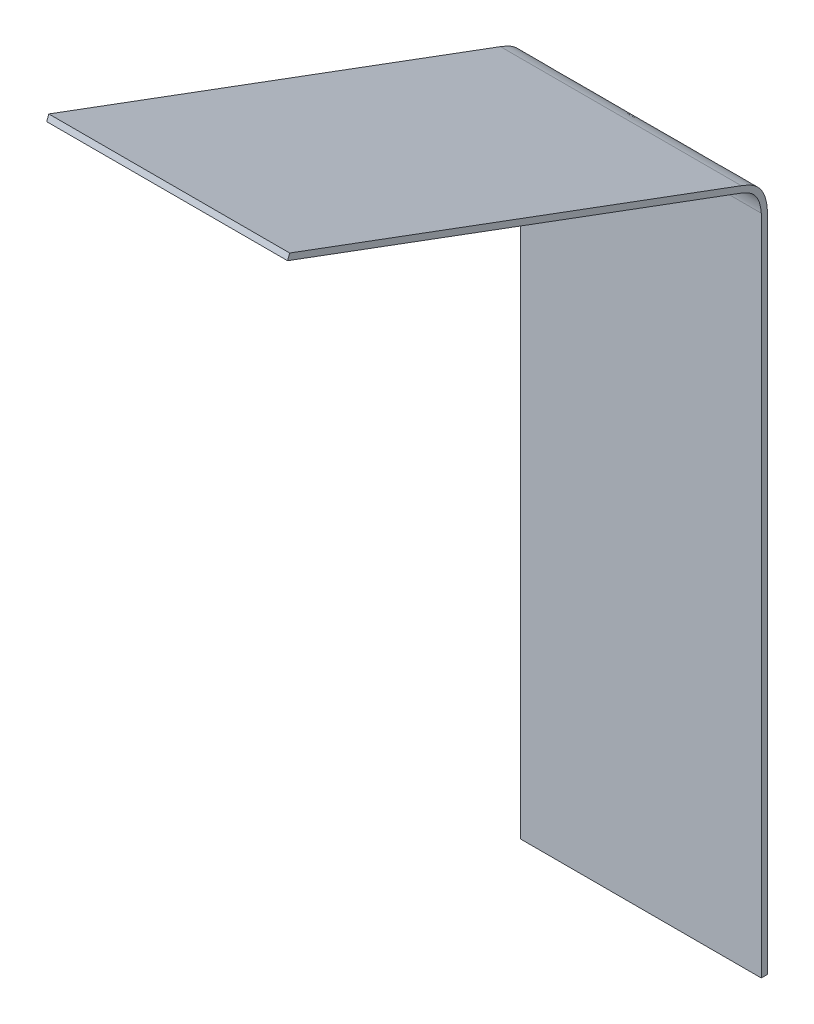
ISO-10303-21;
HEADER;
FILE_DESCRIPTION(('STEP AP214'),'2;1');
FILE_NAME('part.step','',(''),(''),'','','');
FILE_SCHEMA(('AUTOMOTIVE_DESIGN { 1 0 10303 214 1 1 1 1 }'));
ENDSEC;
DATA;
#1=APPLICATION_CONTEXT('core data for automotive mechanical design processes');
#2=APPLICATION_PROTOCOL_DEFINITION('international standard','automotive_design',2000,#1);
#3=PRODUCT_CONTEXT('',#1,'mechanical');
#4=PRODUCT('Part','Part','',(#3));
#5=PRODUCT_RELATED_PRODUCT_CATEGORY('part','',(#4));
#6=PRODUCT_DEFINITION_FORMATION('','',#4);
#7=PRODUCT_DEFINITION_CONTEXT('part definition',#1,'design');
#8=PRODUCT_DEFINITION('design','',#6,#7);
#9=PRODUCT_DEFINITION_SHAPE('','',#8);
#10=(LENGTH_UNIT() NAMED_UNIT(*) SI_UNIT(.MILLI.,.METRE.));
#11=(NAMED_UNIT(*) PLANE_ANGLE_UNIT() SI_UNIT($,.RADIAN.));
#12=(NAMED_UNIT(*) SI_UNIT($,.STERADIAN.) SOLID_ANGLE_UNIT());
#13=UNCERTAINTY_MEASURE_WITH_UNIT(LENGTH_MEASURE(1.E-05),#10,'distance_accuracy_value','');
#14=(GEOMETRIC_REPRESENTATION_CONTEXT(3) GLOBAL_UNCERTAINTY_ASSIGNED_CONTEXT((#13)) GLOBAL_UNIT_ASSIGNED_CONTEXT((#10,
#11,#12)) REPRESENTATION_CONTEXT('',''));
#15=CARTESIAN_POINT('',(0.,0.,0.));
#16=DIRECTION('',(0.,0.,1.));
#17=DIRECTION('',(1.,0.,0.));
#18=AXIS2_PLACEMENT_3D('',#15,#16,#17);
#19=CARTESIAN_POINT('',(10.,-27.5,0.5));
#20=DIRECTION('',(-1.,0.,0.));
#21=DIRECTION('',(0.,0.,1.));
#22=AXIS2_PLACEMENT_3D('',#19,#20,#21);
#23=PLANE('',#22);
#24=DIRECTION('',(0.,1.,0.));
#25=VECTOR('',#24,1.);
#26=CARTESIAN_POINT('',(10.,-27.5,0.));
#27=LINE('',#26,#25);
#28=CARTESIAN_POINT('',(10.,-27.5,0.));
#29=VERTEX_POINT('',#28);
#30=CARTESIAN_POINT('',(10.,27.5,0.));
#31=VERTEX_POINT('',#30);
#32=EDGE_CURVE('E158',#29,#31,#27,.T.);
#33=ORIENTED_EDGE('',*,*,#32,.T.);
#34=CARTESIAN_POINT('',(10.,30.3053928313691,2.15626773205285));
#35=CARTESIAN_POINT('',(10.,30.1974864128318,1.86533608881739));
#36=CARTESIAN_POINT('',(10.,29.952226684656,1.28591543933792));
#37=CARTESIAN_POINT('',(10.,29.4643885200826,0.685759588637019));
#38=CARTESIAN_POINT('',(10.,28.9128358146793,0.33183102841355));
#39=CARTESIAN_POINT('',(10.,28.4224602528136,0.142334357290641));
#40=CARTESIAN_POINT('',(10.,27.8864907898108,0.0317166884469971));
#41=CARTESIAN_POINT('',(10.,27.6386707879078,0.));
#42=CARTESIAN_POINT('',(10.,27.5,0.));
#43=B_SPLINE_CURVE_WITH_KNOTS('',3,(#34,#35,#36,#37,#38,#39,#40,#41,#42),.UNSPECIFIED.,.F.,.F.,
(4,1,1,1,1,1,4),(0.,0.25,0.5,0.625,0.75,0.875,1.),.UNSPECIFIED.);
#44=CARTESIAN_POINT('',(10.,30.3053928313691,2.15626773205285));
#45=VERTEX_POINT('',#44);
#46=EDGE_CURVE('E178',#31,#45,#43,.F.);
#47=ORIENTED_EDGE('',*,*,#46,.T.);
#48=DIRECTION('',(0.,0.347750629196975,0.937587062567049));
#49=VECTOR('',#48,1.);
#50=CARTESIAN_POINT('',(10.,30.3053928313691,2.15626773205285));
#51=LINE('',#50,#49);
#52=CARTESIAN_POINT('',(10.,44.2154179992481,39.6597502347348));
#53=VERTEX_POINT('',#52);
#54=EDGE_CURVE('E181',#45,#53,#51,.T.);
#55=ORIENTED_EDGE('',*,*,#54,.T.);
#56=DIRECTION('',(0.,-0.937587062567048,0.347750629196978));
#57=VECTOR('',#56,1.);
#58=CARTESIAN_POINT('',(10.,44.2154179992481,39.6597502347348));
#59=LINE('',#58,#57);
#60=CARTESIAN_POINT('',(10.,43.7466244679646,39.8336255493333));
#61=VERTEX_POINT('',#60);
#62=EDGE_CURVE('E152',#53,#61,#59,.T.);
#63=ORIENTED_EDGE('',*,*,#62,.T.);
#64=DIRECTION('',(0.,-0.347750629196975,-0.937587062567049));
#65=VECTOR('',#64,1.);
#66=CARTESIAN_POINT('',(10.,29.8365993000855,2.33014304665134));
#67=LINE('',#66,#65);
#68=CARTESIAN_POINT('',(10.,29.8365993000855,2.33014304665134));
#69=VERTEX_POINT('',#68);
#70=EDGE_CURVE('E156',#61,#69,#67,.T.);
#71=ORIENTED_EDGE('',*,*,#70,.T.);
#72=CARTESIAN_POINT('',(10.,27.5,0.5));
#73=CARTESIAN_POINT('',(10.,27.6557787283989,0.5));
#74=CARTESIAN_POINT('',(10.,29.0473017400975,0.711024800769217));
#75=CARTESIAN_POINT('',(10.,29.5263153299715,1.49357163117268));
#76=CARTESIAN_POINT('',(10.,29.8365993000855,2.33014304665134));
#77=B_SPLINE_CURVE_WITH_KNOTS('',3,(#72,#73,#74,#75,#76),.UNSPECIFIED.,.F.,.F.,(4,1,4),(0.,
0.267127670035475,1.),.UNSPECIFIED.);
#78=CARTESIAN_POINT('',(10.,27.5,0.5));
#79=VERTEX_POINT('',#78);
#80=EDGE_CURVE('E111',#69,#79,#77,.F.);
#81=ORIENTED_EDGE('',*,*,#80,.T.);
#82=DIRECTION('',(0.,1.,0.));
#83=VECTOR('',#82,1.);
#84=CARTESIAN_POINT('',(10.,-27.5,0.5));
#85=LINE('',#84,#83);
#86=CARTESIAN_POINT('',(10.,-27.5,0.5));
#87=VERTEX_POINT('',#86);
#88=EDGE_CURVE('E73',#87,#79,#85,.T.);
#89=ORIENTED_EDGE('',*,*,#88,.F.);
#90=DIRECTION('',(0.,0.,-1.));
#91=VECTOR('',#90,1.);
#92=CARTESIAN_POINT('',(10.,-27.5,0.5));
#93=LINE('',#92,#91);
#94=EDGE_CURVE('E41',#87,#29,#93,.T.);
#95=ORIENTED_EDGE('',*,*,#94,.T.);
#96=EDGE_LOOP('',(#33,#47,#55,#63,#71,#81,#89,#95));
#97=FACE_BOUND('',#96,.T.);
#98=ADVANCED_FACE('F33',(#97),#23,.F.);
#99=CARTESIAN_POINT('',(-10.,-27.5,0.5));
#100=DIRECTION('',(1.,0.,0.));
#101=DIRECTION('',(0.,0.,-1.));
#102=AXIS2_PLACEMENT_3D('',#99,#100,#101);
#103=PLANE('',#102);
#104=DIRECTION('',(0.,-1.,0.));
#105=VECTOR('',#104,1.);
#106=CARTESIAN_POINT('',(-10.,-27.5,0.));
#107=LINE('',#106,#105);
#108=CARTESIAN_POINT('',(-10.,27.5,0.));
#109=VERTEX_POINT('',#108);
#110=CARTESIAN_POINT('',(-10.,-27.5,0.));
#111=VERTEX_POINT('',#110);
#112=EDGE_CURVE('E63',#109,#111,#107,.T.);
#113=ORIENTED_EDGE('',*,*,#112,.T.);
#114=DIRECTION('',(0.,0.,-1.));
#115=VECTOR('',#114,1.);
#116=CARTESIAN_POINT('',(-10.,-27.5,0.5));
#117=LINE('',#116,#115);
#118=CARTESIAN_POINT('',(-10.,-27.5,0.5));
#119=VERTEX_POINT('',#118);
#120=EDGE_CURVE('E11',#119,#111,#117,.T.);
#121=ORIENTED_EDGE('',*,*,#120,.F.);
#122=DIRECTION('',(0.,-1.,0.));
#123=VECTOR('',#122,1.);
#124=CARTESIAN_POINT('',(-10.,-27.5,0.5));
#125=LINE('',#124,#123);
#126=CARTESIAN_POINT('',(-10.,27.5,0.5));
#127=VERTEX_POINT('',#126);
#128=EDGE_CURVE('E127',#127,#119,#125,.T.);
#129=ORIENTED_EDGE('',*,*,#128,.F.);
#130=CARTESIAN_POINT('',(-10.,27.5,0.5));
#131=CARTESIAN_POINT('',(-10.,27.6557787283989,0.5));
#132=CARTESIAN_POINT('',(-10.,29.0473017400975,0.711024800769217));
#133=CARTESIAN_POINT('',(-10.,29.5263153299715,1.49357163117268));
#134=CARTESIAN_POINT('',(-10.,29.8365993000855,2.33014304665134));
#135=B_SPLINE_CURVE_WITH_KNOTS('',3,(#130,#131,#132,#133,#134),.UNSPECIFIED.,.F.,.F.,(4,1,4),
(0.,0.267127670035475,1.),.UNSPECIFIED.);
#136=CARTESIAN_POINT('',(-10.,29.8365993000855,2.33014304665134));
#137=VERTEX_POINT('',#136);
#138=EDGE_CURVE('E110',#127,#137,#135,.T.);
#139=ORIENTED_EDGE('',*,*,#138,.T.);
#140=DIRECTION('',(0.,0.347750629196975,0.937587062567049));
#141=VECTOR('',#140,1.);
#142=CARTESIAN_POINT('',(-10.,29.8365993000855,2.33014304665134));
#143=LINE('',#142,#141);
#144=CARTESIAN_POINT('',(-10.,43.7466244679646,39.8336255493333));
#145=VERTEX_POINT('',#144);
#146=EDGE_CURVE('E118',#137,#145,#143,.T.);
#147=ORIENTED_EDGE('',*,*,#146,.T.);
#148=DIRECTION('',(0.,0.937587062567048,-0.347750629196979));
#149=VECTOR('',#148,1.);
#150=CARTESIAN_POINT('',(-10.,44.2154179992481,39.6597502347348));
#151=LINE('',#150,#149);
#152=CARTESIAN_POINT('',(-10.,44.2154179992481,39.6597502347348));
#153=VERTEX_POINT('',#152);
#154=EDGE_CURVE('E123',#145,#153,#151,.T.);
#155=ORIENTED_EDGE('',*,*,#154,.T.);
#156=DIRECTION('',(0.,-0.347750629196975,-0.937587062567049));
#157=VECTOR('',#156,1.);
#158=CARTESIAN_POINT('',(-10.,30.3053928313691,2.15626773205285));
#159=LINE('',#158,#157);
#160=CARTESIAN_POINT('',(-10.,30.3053928313691,2.15626773205285));
#161=VERTEX_POINT('',#160);
#162=EDGE_CURVE('E141',#153,#161,#159,.T.);
#163=ORIENTED_EDGE('',*,*,#162,.T.);
#164=CARTESIAN_POINT('',(-10.,30.3053928313691,2.15626773205285));
#165=CARTESIAN_POINT('',(-10.,30.1974864128318,1.86533608881739));
#166=CARTESIAN_POINT('',(-10.,29.952226684656,1.28591543933792));
#167=CARTESIAN_POINT('',(-10.,29.4643885200826,0.685759588637019));
#168=CARTESIAN_POINT('',(-10.,28.9128358146793,0.33183102841355));
#169=CARTESIAN_POINT('',(-10.,28.4224602528136,0.142334357290641));
#170=CARTESIAN_POINT('',(-10.,27.8864907898108,0.0317166884469971));
#171=CARTESIAN_POINT('',(-10.,27.6386707879078,0.));
#172=CARTESIAN_POINT('',(-10.,27.5,0.));
#173=B_SPLINE_CURVE_WITH_KNOTS('',3,(#164,#165,#166,#167,#168,#169,#170,#171,#172),
.UNSPECIFIED.,.F.,.F.,(4,1,1,1,1,1,4),(0.,0.25,0.5,0.625,0.75,0.875,1.),.UNSPECIFIED.);
#174=EDGE_CURVE('E115',#161,#109,#173,.T.);
#175=ORIENTED_EDGE('',*,*,#174,.T.);
#176=EDGE_LOOP('',(#113,#121,#129,#139,#147,#155,#163,#175));
#177=FACE_BOUND('',#176,.T.);
#178=ADVANCED_FACE('F126',(#177),#103,.F.);
#179=CARTESIAN_POINT('',(-10.,-27.5,0.5));
#180=DIRECTION('',(0.,1.,0.));
#181=DIRECTION('',(0.,0.,1.));
#182=AXIS2_PLACEMENT_3D('',#179,#180,#181);
#183=PLANE('',#182);
#184=DIRECTION('',(1.,0.,0.));
#185=VECTOR('',#184,1.);
#186=CARTESIAN_POINT('',(-10.,-27.5,0.));
#187=LINE('',#186,#185);
#188=EDGE_CURVE('E68',#111,#29,#187,.T.);
#189=ORIENTED_EDGE('',*,*,#188,.T.);
#190=ORIENTED_EDGE('',*,*,#94,.F.);
#191=DIRECTION('',(1.,0.,0.));
#192=VECTOR('',#191,1.);
#193=CARTESIAN_POINT('',(-10.,-27.5,0.5));
#194=LINE('',#193,#192);
#195=EDGE_CURVE('E49',#119,#87,#194,.T.);
#196=ORIENTED_EDGE('',*,*,#195,.F.);
#197=ORIENTED_EDGE('',*,*,#120,.T.);
#198=EDGE_LOOP('',(#189,#190,#196,#197));
#199=FACE_BOUND('',#198,.T.);
#200=ADVANCED_FACE('F210',(#199),#183,.F.);
#201=CARTESIAN_POINT('',(0.,0.,0.5));
#202=DIRECTION('',(0.,0.,-1.));
#203=DIRECTION('',(-1.,0.,0.));
#204=AXIS2_PLACEMENT_3D('',#201,#202,#203);
#205=PLANE('',#204);
#206=ORIENTED_EDGE('',*,*,#88,.T.);
#207=DIRECTION('',(-1.,0.,0.));
#208=VECTOR('',#207,1.);
#209=CARTESIAN_POINT('',(-10.,27.5,0.5));
#210=LINE('',#209,#208);
#211=EDGE_CURVE('E160',#79,#127,#210,.T.);
#212=ORIENTED_EDGE('',*,*,#211,.T.);
#213=ORIENTED_EDGE('',*,*,#128,.T.);
#214=ORIENTED_EDGE('',*,*,#195,.T.);
#215=EDGE_LOOP('',(#206,#212,#213,#214));
#216=FACE_BOUND('',#215,.T.);
#217=ADVANCED_FACE('F207',(#216),#205,.F.);
#218=CARTESIAN_POINT('',(0.,0.,0.));
#219=DIRECTION('',(0.,0.,-1.));
#220=DIRECTION('',(-1.,0.,0.));
#221=AXIS2_PLACEMENT_3D('',#218,#219,#220);
#222=PLANE('',#221);
#223=ORIENTED_EDGE('',*,*,#32,.F.);
#224=ORIENTED_EDGE('',*,*,#188,.F.);
#225=ORIENTED_EDGE('',*,*,#112,.F.);
#226=DIRECTION('',(-1.,0.,0.));
#227=VECTOR('',#226,1.);
#228=CARTESIAN_POINT('',(-10.,27.5,0.));
#229=LINE('',#228,#227);
#230=EDGE_CURVE('E165',#31,#109,#229,.T.);
#231=ORIENTED_EDGE('',*,*,#230,.F.);
#232=EDGE_LOOP('',(#223,#224,#225,#231));
#233=FACE_BOUND('',#232,.T.);
#234=ADVANCED_FACE('F173',(#233),#222,.T.);
#235=CARTESIAN_POINT('',(53.1986449242807,27.5,0.5));
#236=CARTESIAN_POINT('',(53.1986449242807,27.6557787283989,0.5));
#237=CARTESIAN_POINT('',(53.1986449242807,29.0473017400975,0.711024800769217));
#238=CARTESIAN_POINT('',(53.1986449242807,29.5263153299715,1.49357163117268));
#239=CARTESIAN_POINT('',(53.1986449242807,29.8365993000855,2.33014304665134));
#240=B_SPLINE_CURVE_WITH_KNOTS('',3,(#235,#236,#237,#238,#239),.UNSPECIFIED.,.F.,.F.,(4,1,4),
(0.,0.267127670035475,1.),.UNSPECIFIED.);
#241=DIRECTION('',(-1.,0.,0.));
#242=VECTOR('',#241,1.);
#243=SURFACE_OF_LINEAR_EXTRUSION('',#240,#242);
#244=ORIENTED_EDGE('',*,*,#80,.F.);
#245=DIRECTION('',(-1.,0.,0.));
#246=VECTOR('',#245,1.);
#247=CARTESIAN_POINT('',(53.1986449242807,29.8365993000855,2.33014304665134));
#248=LINE('',#247,#246);
#249=EDGE_CURVE('E105',#69,#137,#248,.T.);
#250=ORIENTED_EDGE('',*,*,#249,.T.);
#251=ORIENTED_EDGE('',*,*,#138,.F.);
#252=ORIENTED_EDGE('',*,*,#211,.F.);
#253=EDGE_LOOP('',(#244,#250,#251,#252));
#254=FACE_BOUND('',#253,.T.);
#255=ADVANCED_FACE('F107',(#254),#243,.T.);
#256=CARTESIAN_POINT('',(53.1986449242807,30.3053928313691,2.15626773205285));
#257=CARTESIAN_POINT('',(53.1986449242807,30.1974864128318,1.86533608881739));
#258=CARTESIAN_POINT('',(53.1986449242807,29.952226684656,1.28591543933792));
#259=CARTESIAN_POINT('',(53.1986449242807,29.4643885200826,0.685759588637019));
#260=CARTESIAN_POINT('',(53.1986449242807,28.9128358146793,0.33183102841355));
#261=CARTESIAN_POINT('',(53.1986449242807,28.4224602528136,0.142334357290641));
#262=CARTESIAN_POINT('',(53.1986449242807,27.8864907898108,0.0317166884469971));
#263=CARTESIAN_POINT('',(53.1986449242807,27.6386707879078,0.));
#264=CARTESIAN_POINT('',(53.1986449242807,27.5,0.));
#265=B_SPLINE_CURVE_WITH_KNOTS('',3,(#256,#257,#258,#259,#260,#261,#262,#263,#264),
.UNSPECIFIED.,.F.,.F.,(4,1,1,1,1,1,4),(0.,0.25,0.5,0.625,0.75,0.875,1.),.UNSPECIFIED.);
#266=DIRECTION('',(-1.,0.,0.));
#267=VECTOR('',#266,1.);
#268=SURFACE_OF_LINEAR_EXTRUSION('',#265,#267);
#269=ORIENTED_EDGE('',*,*,#46,.F.);
#270=ORIENTED_EDGE('',*,*,#230,.T.);
#271=ORIENTED_EDGE('',*,*,#174,.F.);
#272=DIRECTION('',(-1.,0.,0.));
#273=VECTOR('',#272,1.);
#274=CARTESIAN_POINT('',(53.1986449242807,30.3053928313691,2.15626773205285));
#275=LINE('',#274,#273);
#276=EDGE_CURVE('E147',#45,#161,#275,.T.);
#277=ORIENTED_EDGE('',*,*,#276,.F.);
#278=EDGE_LOOP('',(#269,#270,#271,#277));
#279=FACE_BOUND('',#278,.T.);
#280=ADVANCED_FACE('F179',(#279),#268,.T.);
#281=CARTESIAN_POINT('',(53.1986449242807,30.3053928313691,2.15626773205285));
#282=DIRECTION('',(0.,0.937587062567049,-0.347750629196975));
#283=DIRECTION('',(0.,0.347750629196975,0.937587062567049));
#284=AXIS2_PLACEMENT_3D('',#281,#282,#283);
#285=PLANE('',#284);
#286=ORIENTED_EDGE('',*,*,#54,.F.);
#287=ORIENTED_EDGE('',*,*,#276,.T.);
#288=ORIENTED_EDGE('',*,*,#162,.F.);
#289=DIRECTION('',(-1.,0.,0.));
#290=VECTOR('',#289,1.);
#291=CARTESIAN_POINT('',(53.1986449242807,44.2154179992481,39.6597502347348));
#292=LINE('',#291,#290);
#293=EDGE_CURVE('E153',#53,#153,#292,.T.);
#294=ORIENTED_EDGE('',*,*,#293,.F.);
#295=EDGE_LOOP('',(#286,#287,#288,#294));
#296=FACE_BOUND('',#295,.T.);
#297=ADVANCED_FACE('F256',(#296),#285,.T.);
#298=CARTESIAN_POINT('',(53.1986449242807,44.2154179992481,39.6597502347348));
#299=DIRECTION('',(0.,0.347750629196978,0.937587062567048));
#300=DIRECTION('',(0.,-0.937587062567048,0.347750629196978));
#301=AXIS2_PLACEMENT_3D('',#298,#299,#300);
#302=PLANE('',#301);
#303=ORIENTED_EDGE('',*,*,#62,.F.);
#304=ORIENTED_EDGE('',*,*,#293,.T.);
#305=ORIENTED_EDGE('',*,*,#154,.F.);
#306=DIRECTION('',(-1.,0.,0.));
#307=VECTOR('',#306,1.);
#308=CARTESIAN_POINT('',(53.1986449242807,43.7466244679646,39.8336255493333));
#309=LINE('',#308,#307);
#310=EDGE_CURVE('E114',#61,#145,#309,.T.);
#311=ORIENTED_EDGE('',*,*,#310,.F.);
#312=EDGE_LOOP('',(#303,#304,#305,#311));
#313=FACE_BOUND('',#312,.T.);
#314=ADVANCED_FACE('F265',(#313),#302,.T.);
#315=CARTESIAN_POINT('',(53.1986449242807,29.8365993000855,2.33014304665134));
#316=DIRECTION('',(0.,-0.937587062567049,0.347750629196975));
#317=DIRECTION('',(0.,-0.347750629196975,-0.937587062567049));
#318=AXIS2_PLACEMENT_3D('',#315,#316,#317);
#319=PLANE('',#318);
#320=ORIENTED_EDGE('',*,*,#70,.F.);
#321=ORIENTED_EDGE('',*,*,#310,.T.);
#322=ORIENTED_EDGE('',*,*,#146,.F.);
#323=ORIENTED_EDGE('',*,*,#249,.F.);
#324=EDGE_LOOP('',(#320,#321,#322,#323));
#325=FACE_BOUND('',#324,.T.);
#326=ADVANCED_FACE('F119',(#325),#319,.T.);
#327=CLOSED_SHELL('',(#98,#178,#200,#217,#234,#255,#280,#297,#314,#326));
#328=MANIFOLD_SOLID_BREP('B2',#327);
#329=ADVANCED_BREP_SHAPE_REPRESENTATION('',(#18,#328),#14);
#330=SHAPE_DEFINITION_REPRESENTATION(#9,#329);
ENDSEC;
END-ISO-10303-21;
